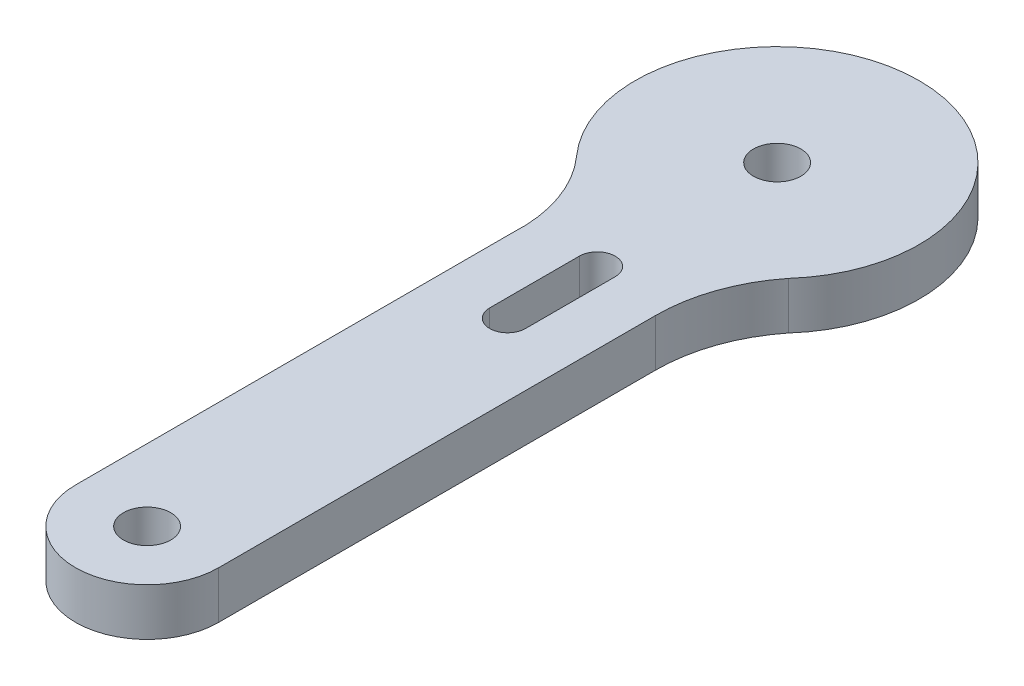
ISO-10303-21;
HEADER;
FILE_DESCRIPTION(('STEP AP214'),'2;1');
FILE_NAME('part.step','',(''),(''),'','','');
FILE_SCHEMA(('AUTOMOTIVE_DESIGN { 1 0 10303 214 1 1 1 1 }'));
ENDSEC;
DATA;
#1=APPLICATION_CONTEXT('core data for automotive mechanical design processes');
#2=APPLICATION_PROTOCOL_DEFINITION('international standard','automotive_design',2000,#1);
#3=PRODUCT_CONTEXT('',#1,'mechanical');
#4=PRODUCT('Part','Part','',(#3));
#5=PRODUCT_RELATED_PRODUCT_CATEGORY('part','',(#4));
#6=PRODUCT_DEFINITION_FORMATION('','',#4);
#7=PRODUCT_DEFINITION_CONTEXT('part definition',#1,'design');
#8=PRODUCT_DEFINITION('design','',#6,#7);
#9=PRODUCT_DEFINITION_SHAPE('','',#8);
#10=(LENGTH_UNIT() NAMED_UNIT(*) SI_UNIT(.MILLI.,.METRE.));
#11=(NAMED_UNIT(*) PLANE_ANGLE_UNIT() SI_UNIT($,.RADIAN.));
#12=(NAMED_UNIT(*) SI_UNIT($,.STERADIAN.) SOLID_ANGLE_UNIT());
#13=UNCERTAINTY_MEASURE_WITH_UNIT(LENGTH_MEASURE(1.E-05),#10,'distance_accuracy_value','');
#14=(GEOMETRIC_REPRESENTATION_CONTEXT(3) GLOBAL_UNCERTAINTY_ASSIGNED_CONTEXT((#13)) GLOBAL_UNIT_ASSIGNED_CONTEXT((#10,
#11,#12)) REPRESENTATION_CONTEXT('',''));
#15=CARTESIAN_POINT('',(0.,0.,0.));
#16=DIRECTION('',(0.,0.,1.));
#17=DIRECTION('',(1.,0.,0.));
#18=AXIS2_PLACEMENT_3D('',#15,#16,#17);
#19=CARTESIAN_POINT('',(14.3483212893798,3.048,-7.38545450211768));
#20=DIRECTION('',(0.,-1.,0.));
#21=DIRECTION('',(0.,0.,-1.));
#22=AXIS2_PLACEMENT_3D('',#19,#20,#21);
#23=PLANE('',#22);
#24=CARTESIAN_POINT('',(-0.49046409629303,3.048,-19.8255035501036));
#25=DIRECTION('',(0.,1.,0.));
#26=DIRECTION('',(0.,0.,1.));
#27=AXIS2_PLACEMENT_3D('',#24,#25,#26);
#28=CIRCLE('',#27,1.524);
#29=CARTESIAN_POINT('',(-0.49046409629303,3.048,-21.3495035501036));
#30=VERTEX_POINT('',#29);
#31=EDGE_CURVE('E148',#30,#30,#28,.T.);
#32=ORIENTED_EDGE('',*,*,#31,.F.);
#33=EDGE_LOOP('',(#32));
#34=FACE_BOUND('',#33,.T.);
#35=CARTESIAN_POINT('',(14.3483212893798,3.048,-7.38545450211768));
#36=DIRECTION('',(0.,-1.,0.));
#37=DIRECTION('',(0.,0.,-1.));
#38=AXIS2_PLACEMENT_3D('',#35,#36,#37);
#39=CIRCLE('',#38,10.2282816118927);
#40=CARTESIAN_POINT('',(4.12003967748704,3.048,-7.38545450211768));
#41=VERTEX_POINT('',#40);
#42=CARTESIAN_POINT('',(6.32601765129162,3.048,-13.7305619929724));
#43=VERTEX_POINT('',#42);
#44=EDGE_CURVE('E154',#41,#43,#39,.T.);
#45=ORIENTED_EDGE('',*,*,#44,.T.);
#46=CARTESIAN_POINT('',(-0.49046409629303,3.048,-19.8255035501036));
#47=DIRECTION('',(0.,1.,0.));
#48=DIRECTION('',(0.,0.,1.));
#49=AXIS2_PLACEMENT_3D('',#46,#47,#48);
#50=CIRCLE('',#49,9.144);
#51=CARTESIAN_POINT('',(-7.30694584387768,3.048,-13.7305619929724));
#52=VERTEX_POINT('',#51);
#53=EDGE_CURVE('E157',#43,#52,#50,.T.);
#54=ORIENTED_EDGE('',*,*,#53,.T.);
#55=CARTESIAN_POINT('',(-13.8140717595721,3.048,-7.9122302450579));
#56=DIRECTION('',(0.,-1.,0.));
#57=DIRECTION('',(0.,0.,-1.));
#58=AXIS2_PLACEMENT_3D('',#55,#56,#57);
#59=CIRCLE('',#58,8.72901323240442);
#60=CARTESIAN_POINT('',(-5.10096787357709,3.048,-7.38545450211768));
#61=VERTEX_POINT('',#60);
#62=EDGE_CURVE('E160',#52,#61,#59,.T.);
#63=ORIENTED_EDGE('',*,*,#62,.T.);
#64=DIRECTION('',(0.,0.,1.));
#65=VECTOR('',#64,1.);
#66=CARTESIAN_POINT('',(-5.10096787357708,3.048,20.7354787461048));
#67=LINE('',#66,#65);
#68=CARTESIAN_POINT('',(-5.10096787357708,3.048,20.7354787461048));
#69=VERTEX_POINT('',#68);
#70=EDGE_CURVE('E162',#61,#69,#67,.T.);
#71=ORIENTED_EDGE('',*,*,#70,.T.);
#72=CARTESIAN_POINT('',(-0.490464098045022,3.048,20.7354787461048));
#73=DIRECTION('',(0.,1.,0.));
#74=DIRECTION('',(0.,0.,1.));
#75=AXIS2_PLACEMENT_3D('',#72,#73,#74);
#76=CIRCLE('',#75,4.61050377553206);
#77=CARTESIAN_POINT('',(4.12003967748704,3.048,20.7354787461048));
#78=VERTEX_POINT('',#77);
#79=EDGE_CURVE('E164',#69,#78,#76,.T.);
#80=ORIENTED_EDGE('',*,*,#79,.T.);
#81=DIRECTION('',(0.,0.,-1.));
#82=VECTOR('',#81,1.);
#83=CARTESIAN_POINT('',(4.12003967748704,3.048,-7.38545450211768));
#84=LINE('',#83,#82);
#85=EDGE_CURVE('E166',#78,#41,#84,.T.);
#86=ORIENTED_EDGE('',*,*,#85,.T.);
#87=EDGE_LOOP('',(#45,#54,#63,#71,#80,#86));
#88=FACE_BOUND('',#87,.T.);
#89=CARTESIAN_POINT('',(-0.490500680274846,3.048,-8.2468715254583));
#90=DIRECTION('',(0.,1.,0.));
#91=DIRECTION('',(0.,0.,-1.));
#92=AXIS2_PLACEMENT_3D('',#89,#90,#91);
#93=CIRCLE('',#92,1.1526259438827);
#94=CARTESIAN_POINT('',(0.662125263607858,3.048,-8.2468715254583));
#95=VERTEX_POINT('',#94);
#96=CARTESIAN_POINT('',(-1.64312662415755,3.048,-8.2468715254583));
#97=VERTEX_POINT('',#96);
#98=EDGE_CURVE('E109',#95,#97,#93,.T.);
#99=ORIENTED_EDGE('',*,*,#98,.F.);
#100=DIRECTION('',(0.,0.,-1.));
#101=VECTOR('',#100,1.);
#102=CARTESIAN_POINT('',(0.662125263607858,3.048,-2.4732754603921));
#103=LINE('',#102,#101);
#104=CARTESIAN_POINT('',(0.662125263607858,3.048,-2.4732754603921));
#105=VERTEX_POINT('',#104);
#106=EDGE_CURVE('E132',#105,#95,#103,.T.);
#107=ORIENTED_EDGE('',*,*,#106,.F.);
#108=CARTESIAN_POINT('',(-0.490500680274846,3.048,-2.4732754603921));
#109=DIRECTION('',(0.,1.,0.));
#110=DIRECTION('',(0.,0.,1.));
#111=AXIS2_PLACEMENT_3D('',#108,#109,#110);
#112=CIRCLE('',#111,1.1526259438827);
#113=CARTESIAN_POINT('',(-1.64312662415755,3.048,-2.4732754603921));
#114=VERTEX_POINT('',#113);
#115=EDGE_CURVE('E130',#114,#105,#112,.T.);
#116=ORIENTED_EDGE('',*,*,#115,.F.);
#117=DIRECTION('',(0.,0.,1.));
#118=VECTOR('',#117,1.);
#119=CARTESIAN_POINT('',(-1.64312662415755,3.048,-8.2468715254583));
#120=LINE('',#119,#118);
#121=EDGE_CURVE('E117',#97,#114,#120,.T.);
#122=ORIENTED_EDGE('',*,*,#121,.F.);
#123=EDGE_LOOP('',(#99,#107,#116,#122));
#124=FACE_BOUND('',#123,.T.);
#125=CARTESIAN_POINT('',(-0.490464098045022,3.048,20.7354787461048));
#126=DIRECTION('',(0.,1.,0.));
#127=DIRECTION('',(0.,0.,1.));
#128=AXIS2_PLACEMENT_3D('',#125,#126,#127);
#129=CIRCLE('',#128,1.524);
#130=CARTESIAN_POINT('',(-0.490464098045022,3.048,19.2114787461048));
#131=VERTEX_POINT('',#130);
#132=EDGE_CURVE('E138',#131,#131,#129,.T.);
#133=ORIENTED_EDGE('',*,*,#132,.F.);
#134=EDGE_LOOP('',(#133));
#135=FACE_BOUND('',#134,.T.);
#136=ADVANCED_FACE('F32',(#34,#88,#124,#135),#23,.F.);
#137=CARTESIAN_POINT('',(14.3483212893798,0.,-7.38545450211768));
#138=DIRECTION('',(0.,-1.,0.));
#139=DIRECTION('',(0.,0.,-1.));
#140=AXIS2_PLACEMENT_3D('',#137,#138,#139);
#141=PLANE('',#140);
#142=DIRECTION('',(0.,0.,-1.));
#143=VECTOR('',#142,1.);
#144=CARTESIAN_POINT('',(0.662125263607858,0.,-2.4732754603921));
#145=LINE('',#144,#143);
#146=CARTESIAN_POINT('',(0.662125263607858,0.,-2.4732754603921));
#147=VERTEX_POINT('',#146);
#148=CARTESIAN_POINT('',(0.662125263607857,0.,-8.2468715254583));
#149=VERTEX_POINT('',#148);
#150=EDGE_CURVE('E118',#147,#149,#145,.T.);
#151=ORIENTED_EDGE('',*,*,#150,.T.);
#152=CARTESIAN_POINT('',(-0.490500680274846,0.,-8.2468715254583));
#153=DIRECTION('',(0.,1.,0.));
#154=DIRECTION('',(0.,0.,-1.));
#155=AXIS2_PLACEMENT_3D('',#152,#153,#154);
#156=CIRCLE('',#155,1.1526259438827);
#157=CARTESIAN_POINT('',(-1.64312662415755,0.,-8.2468715254583));
#158=VERTEX_POINT('',#157);
#159=EDGE_CURVE('E55',#149,#158,#156,.T.);
#160=ORIENTED_EDGE('',*,*,#159,.T.);
#161=DIRECTION('',(0.,0.,1.));
#162=VECTOR('',#161,1.);
#163=CARTESIAN_POINT('',(-1.64312662415755,0.,-8.2468715254583));
#164=LINE('',#163,#162);
#165=CARTESIAN_POINT('',(-1.64312662415755,0.,-2.4732754603921));
#166=VERTEX_POINT('',#165);
#167=EDGE_CURVE('E124',#158,#166,#164,.T.);
#168=ORIENTED_EDGE('',*,*,#167,.T.);
#169=CARTESIAN_POINT('',(-0.490500680274846,0.,-2.4732754603921));
#170=DIRECTION('',(0.,1.,0.));
#171=DIRECTION('',(0.,0.,1.));
#172=AXIS2_PLACEMENT_3D('',#169,#170,#171);
#173=CIRCLE('',#172,1.1526259438827);
#174=EDGE_CURVE('E140',#166,#147,#173,.T.);
#175=ORIENTED_EDGE('',*,*,#174,.T.);
#176=EDGE_LOOP('',(#151,#160,#168,#175));
#177=FACE_BOUND('',#176,.T.);
#178=CARTESIAN_POINT('',(-0.49046409629303,0.,-19.8255035501036));
#179=DIRECTION('',(0.,1.,0.));
#180=DIRECTION('',(0.,0.,1.));
#181=AXIS2_PLACEMENT_3D('',#178,#179,#180);
#182=CIRCLE('',#181,1.524);
#183=CARTESIAN_POINT('',(-0.49046409629303,0.,-21.3495035501036));
#184=VERTEX_POINT('',#183);
#185=EDGE_CURVE('E125',#184,#184,#182,.T.);
#186=ORIENTED_EDGE('',*,*,#185,.T.);
#187=EDGE_LOOP('',(#186));
#188=FACE_BOUND('',#187,.T.);
#189=CARTESIAN_POINT('',(14.3483212893798,0.,-7.38545450211768));
#190=DIRECTION('',(0.,-1.,0.));
#191=DIRECTION('',(0.,0.,-1.));
#192=AXIS2_PLACEMENT_3D('',#189,#190,#191);
#193=CIRCLE('',#192,10.2282816118927);
#194=CARTESIAN_POINT('',(4.12003967748704,0.,-7.38545450211768));
#195=VERTEX_POINT('',#194);
#196=CARTESIAN_POINT('',(6.32601765129162,0.,-13.7305619929724));
#197=VERTEX_POINT('',#196);
#198=EDGE_CURVE('E151',#195,#197,#193,.T.);
#199=ORIENTED_EDGE('',*,*,#198,.F.);
#200=DIRECTION('',(0.,0.,-1.));
#201=VECTOR('',#200,1.);
#202=CARTESIAN_POINT('',(4.12003967748704,0.,-7.38545450211768));
#203=LINE('',#202,#201);
#204=CARTESIAN_POINT('',(4.12003967748704,0.,20.7354787461048));
#205=VERTEX_POINT('',#204);
#206=EDGE_CURVE('E158',#205,#195,#203,.T.);
#207=ORIENTED_EDGE('',*,*,#206,.F.);
#208=CARTESIAN_POINT('',(-0.490464098045022,0.,20.7354787461048));
#209=DIRECTION('',(0.,1.,0.));
#210=DIRECTION('',(0.,0.,1.));
#211=AXIS2_PLACEMENT_3D('',#208,#209,#210);
#212=CIRCLE('',#211,4.61050377553206);
#213=CARTESIAN_POINT('',(-5.10096787357708,0.,20.7354787461048));
#214=VERTEX_POINT('',#213);
#215=EDGE_CURVE('E177',#214,#205,#212,.T.);
#216=ORIENTED_EDGE('',*,*,#215,.F.);
#217=DIRECTION('',(0.,0.,1.));
#218=VECTOR('',#217,1.);
#219=CARTESIAN_POINT('',(-5.10096787357708,0.,20.7354787461048));
#220=LINE('',#219,#218);
#221=CARTESIAN_POINT('',(-5.10096787357709,0.,-7.38545450211768));
#222=VERTEX_POINT('',#221);
#223=EDGE_CURVE('E175',#222,#214,#220,.T.);
#224=ORIENTED_EDGE('',*,*,#223,.F.);
#225=CARTESIAN_POINT('',(-13.8140717595721,0.,-7.9122302450579));
#226=DIRECTION('',(0.,-1.,0.));
#227=DIRECTION('',(0.,0.,-1.));
#228=AXIS2_PLACEMENT_3D('',#225,#226,#227);
#229=CIRCLE('',#228,8.72901323240442);
#230=CARTESIAN_POINT('',(-7.30694584387768,0.,-13.7305619929724));
#231=VERTEX_POINT('',#230);
#232=EDGE_CURVE('E173',#231,#222,#229,.T.);
#233=ORIENTED_EDGE('',*,*,#232,.F.);
#234=CARTESIAN_POINT('',(-0.49046409629303,0.,-19.8255035501036));
#235=DIRECTION('',(0.,1.,0.));
#236=DIRECTION('',(0.,0.,1.));
#237=AXIS2_PLACEMENT_3D('',#234,#235,#236);
#238=CIRCLE('',#237,9.144);
#239=EDGE_CURVE('E171',#197,#231,#238,.T.);
#240=ORIENTED_EDGE('',*,*,#239,.F.);
#241=EDGE_LOOP('',(#199,#207,#216,#224,#233,#240));
#242=FACE_BOUND('',#241,.T.);
#243=CARTESIAN_POINT('',(-0.490464098045022,0.,20.7354787461048));
#244=DIRECTION('',(0.,1.,0.));
#245=DIRECTION('',(0.,0.,1.));
#246=AXIS2_PLACEMENT_3D('',#243,#244,#245);
#247=CIRCLE('',#246,1.524);
#248=CARTESIAN_POINT('',(-0.490464098045022,0.,19.2114787461048));
#249=VERTEX_POINT('',#248);
#250=EDGE_CURVE('E263',#249,#249,#247,.T.);
#251=ORIENTED_EDGE('',*,*,#250,.T.);
#252=EDGE_LOOP('',(#251));
#253=FACE_BOUND('',#252,.T.);
#254=ADVANCED_FACE('F201',(#177,#188,#242,#253),#141,.T.);
#255=CARTESIAN_POINT('',(14.3483212893798,3.048,-7.38545450211768));
#256=DIRECTION('',(0.,-1.,0.));
#257=DIRECTION('',(0.,0.,-1.));
#258=AXIS2_PLACEMENT_3D('',#255,#256,#257);
#259=CYLINDRICAL_SURFACE('',#258,10.2282816118927);
#260=ORIENTED_EDGE('',*,*,#198,.T.);
#261=DIRECTION('',(0.,-1.,0.));
#262=VECTOR('',#261,1.);
#263=CARTESIAN_POINT('',(6.32601765129162,3.048,-13.7305619929724));
#264=LINE('',#263,#262);
#265=EDGE_CURVE('E11',#43,#197,#264,.T.);
#266=ORIENTED_EDGE('',*,*,#265,.F.);
#267=ORIENTED_EDGE('',*,*,#44,.F.);
#268=DIRECTION('',(0.,-1.,0.));
#269=VECTOR('',#268,1.);
#270=CARTESIAN_POINT('',(4.12003967748704,3.048,-7.38545450211768));
#271=LINE('',#270,#269);
#272=EDGE_CURVE('E168',#41,#195,#271,.T.);
#273=ORIENTED_EDGE('',*,*,#272,.T.);
#274=EDGE_LOOP('',(#260,#266,#267,#273));
#275=FACE_BOUND('',#274,.T.);
#276=ADVANCED_FACE('F34',(#275),#259,.F.);
#277=CARTESIAN_POINT('',(-0.49046409629303,3.048,-19.8255035501036));
#278=DIRECTION('',(0.,-1.,0.));
#279=DIRECTION('',(0.,0.,-1.));
#280=AXIS2_PLACEMENT_3D('',#277,#278,#279);
#281=CYLINDRICAL_SURFACE('',#280,9.144);
#282=ORIENTED_EDGE('',*,*,#239,.T.);
#283=DIRECTION('',(0.,-1.,0.));
#284=VECTOR('',#283,1.);
#285=CARTESIAN_POINT('',(-7.30694584387768,3.048,-13.7305619929724));
#286=LINE('',#285,#284);
#287=EDGE_CURVE('E40',#52,#231,#286,.T.);
#288=ORIENTED_EDGE('',*,*,#287,.F.);
#289=ORIENTED_EDGE('',*,*,#53,.F.);
#290=ORIENTED_EDGE('',*,*,#265,.T.);
#291=EDGE_LOOP('',(#282,#288,#289,#290));
#292=FACE_BOUND('',#291,.T.);
#293=ADVANCED_FACE('F218',(#292),#281,.T.);
#294=CARTESIAN_POINT('',(-13.8140717595721,3.048,-7.9122302450579));
#295=DIRECTION('',(0.,-1.,0.));
#296=DIRECTION('',(0.,0.,-1.));
#297=AXIS2_PLACEMENT_3D('',#294,#295,#296);
#298=CYLINDRICAL_SURFACE('',#297,8.72901323240442);
#299=ORIENTED_EDGE('',*,*,#232,.T.);
#300=DIRECTION('',(0.,-1.,0.));
#301=VECTOR('',#300,1.);
#302=CARTESIAN_POINT('',(-5.10096787357709,3.048,-7.38545450211768));
#303=LINE('',#302,#301);
#304=EDGE_CURVE('E188',#61,#222,#303,.T.);
#305=ORIENTED_EDGE('',*,*,#304,.F.);
#306=ORIENTED_EDGE('',*,*,#62,.F.);
#307=ORIENTED_EDGE('',*,*,#287,.T.);
#308=EDGE_LOOP('',(#299,#305,#306,#307));
#309=FACE_BOUND('',#308,.T.);
#310=ADVANCED_FACE('F195',(#309),#298,.F.);
#311=CARTESIAN_POINT('',(-5.10096787357708,3.048,20.7354787461048));
#312=DIRECTION('',(1.,0.,0.));
#313=DIRECTION('',(0.,0.,-1.));
#314=AXIS2_PLACEMENT_3D('',#311,#312,#313);
#315=PLANE('',#314);
#316=ORIENTED_EDGE('',*,*,#223,.T.);
#317=DIRECTION('',(0.,-1.,0.));
#318=VECTOR('',#317,1.);
#319=CARTESIAN_POINT('',(-5.10096787357708,3.048,20.7354787461048));
#320=LINE('',#319,#318);
#321=EDGE_CURVE('E185',#69,#214,#320,.T.);
#322=ORIENTED_EDGE('',*,*,#321,.F.);
#323=ORIENTED_EDGE('',*,*,#70,.F.);
#324=ORIENTED_EDGE('',*,*,#304,.T.);
#325=EDGE_LOOP('',(#316,#322,#323,#324));
#326=FACE_BOUND('',#325,.T.);
#327=ADVANCED_FACE('F207',(#326),#315,.F.);
#328=CARTESIAN_POINT('',(-0.490464098045022,3.048,20.7354787461048));
#329=DIRECTION('',(0.,-1.,0.));
#330=DIRECTION('',(0.,0.,-1.));
#331=AXIS2_PLACEMENT_3D('',#328,#329,#330);
#332=CYLINDRICAL_SURFACE('',#331,4.61050377553206);
#333=ORIENTED_EDGE('',*,*,#215,.T.);
#334=DIRECTION('',(0.,-1.,0.));
#335=VECTOR('',#334,1.);
#336=CARTESIAN_POINT('',(4.12003967748704,3.048,20.7354787461048));
#337=LINE('',#336,#335);
#338=EDGE_CURVE('E182',#78,#205,#337,.T.);
#339=ORIENTED_EDGE('',*,*,#338,.F.);
#340=ORIENTED_EDGE('',*,*,#79,.F.);
#341=ORIENTED_EDGE('',*,*,#321,.T.);
#342=EDGE_LOOP('',(#333,#339,#340,#341));
#343=FACE_BOUND('',#342,.T.);
#344=ADVANCED_FACE('F211',(#343),#332,.T.);
#345=CARTESIAN_POINT('',(4.12003967748704,3.048,-7.38545450211768));
#346=DIRECTION('',(-1.,0.,0.));
#347=DIRECTION('',(0.,0.,1.));
#348=AXIS2_PLACEMENT_3D('',#345,#346,#347);
#349=PLANE('',#348);
#350=ORIENTED_EDGE('',*,*,#206,.T.);
#351=ORIENTED_EDGE('',*,*,#272,.F.);
#352=ORIENTED_EDGE('',*,*,#85,.F.);
#353=ORIENTED_EDGE('',*,*,#338,.T.);
#354=EDGE_LOOP('',(#350,#351,#352,#353));
#355=FACE_BOUND('',#354,.T.);
#356=ADVANCED_FACE('F221',(#355),#349,.F.);
#357=CARTESIAN_POINT('',(-0.49046409629303,3.048,-19.8255035501036));
#358=DIRECTION('',(0.,-1.,0.));
#359=DIRECTION('',(0.,0.,-1.));
#360=AXIS2_PLACEMENT_3D('',#357,#358,#359);
#361=CYLINDRICAL_SURFACE('',#360,1.524);
#362=CARTESIAN_POINT('',(-0.49046409629303,3.048,-21.3495035501036));
#363=CARTESIAN_POINT('',(-0.49046409629303,3.01625,-21.3495035501036));
#364=CARTESIAN_POINT('',(-0.49046409629303,2.9845,-21.3495035501036));
#365=CARTESIAN_POINT('',(-0.49046409629303,2.921,-21.3495035501036));
#366=CARTESIAN_POINT('',(-0.49046409629303,2.88925,-21.3495035501036));
#367=CARTESIAN_POINT('',(-0.49046409629303,2.82575,-21.3495035501036));
#368=CARTESIAN_POINT('',(-0.49046409629303,2.794,-21.3495035501036));
#369=CARTESIAN_POINT('',(-0.49046409629303,2.7305,-21.3495035501036));
#370=CARTESIAN_POINT('',(-0.49046409629303,2.69875,-21.3495035501036));
#371=CARTESIAN_POINT('',(-0.49046409629303,2.63525,-21.3495035501036));
#372=CARTESIAN_POINT('',(-0.49046409629303,2.6035,-21.3495035501036));
#373=CARTESIAN_POINT('',(-0.49046409629303,2.54,-21.3495035501036));
#374=CARTESIAN_POINT('',(-0.49046409629303,2.50825,-21.3495035501036));
#375=CARTESIAN_POINT('',(-0.49046409629303,2.44475,-21.3495035501036));
#376=CARTESIAN_POINT('',(-0.49046409629303,2.413,-21.3495035501036));
#377=CARTESIAN_POINT('',(-0.49046409629303,2.3495,-21.3495035501036));
#378=CARTESIAN_POINT('',(-0.49046409629303,2.31775,-21.3495035501036));
#379=CARTESIAN_POINT('',(-0.49046409629303,2.25425,-21.3495035501036));
#380=CARTESIAN_POINT('',(-0.49046409629303,2.2225,-21.3495035501036));
#381=CARTESIAN_POINT('',(-0.49046409629303,2.159,-21.3495035501036));
#382=CARTESIAN_POINT('',(-0.49046409629303,2.12725,-21.3495035501036));
#383=CARTESIAN_POINT('',(-0.49046409629303,2.06375,-21.3495035501036));
#384=CARTESIAN_POINT('',(-0.49046409629303,2.032,-21.3495035501036));
#385=CARTESIAN_POINT('',(-0.49046409629303,1.9685,-21.3495035501036));
#386=CARTESIAN_POINT('',(-0.49046409629303,1.93675,-21.3495035501036));
#387=CARTESIAN_POINT('',(-0.49046409629303,1.87325,-21.3495035501036));
#388=CARTESIAN_POINT('',(-0.49046409629303,1.8415,-21.3495035501036));
#389=CARTESIAN_POINT('',(-0.49046409629303,1.778,-21.3495035501036));
#390=CARTESIAN_POINT('',(-0.49046409629303,1.74625,-21.3495035501036));
#391=CARTESIAN_POINT('',(-0.49046409629303,1.68275,-21.3495035501036));
#392=CARTESIAN_POINT('',(-0.49046409629303,1.651,-21.3495035501036));
#393=CARTESIAN_POINT('',(-0.49046409629303,1.5875,-21.3495035501036));
#394=CARTESIAN_POINT('',(-0.49046409629303,1.55575,-21.3495035501036));
#395=CARTESIAN_POINT('',(-0.49046409629303,1.49225,-21.3495035501036));
#396=CARTESIAN_POINT('',(-0.49046409629303,1.4605,-21.3495035501036));
#397=CARTESIAN_POINT('',(-0.49046409629303,1.397,-21.3495035501036));
#398=CARTESIAN_POINT('',(-0.49046409629303,1.36525,-21.3495035501036));
#399=CARTESIAN_POINT('',(-0.49046409629303,1.30175,-21.3495035501036));
#400=CARTESIAN_POINT('',(-0.49046409629303,1.27,-21.3495035501036));
#401=CARTESIAN_POINT('',(-0.49046409629303,1.2065,-21.3495035501036));
#402=CARTESIAN_POINT('',(-0.49046409629303,1.17475,-21.3495035501036));
#403=CARTESIAN_POINT('',(-0.49046409629303,1.11125,-21.3495035501036));
#404=CARTESIAN_POINT('',(-0.49046409629303,1.0795,-21.3495035501036));
#405=CARTESIAN_POINT('',(-0.49046409629303,1.016,-21.3495035501036));
#406=CARTESIAN_POINT('',(-0.49046409629303,0.98425,-21.3495035501036));
#407=CARTESIAN_POINT('',(-0.49046409629303,0.92075,-21.3495035501036));
#408=CARTESIAN_POINT('',(-0.49046409629303,0.889,-21.3495035501036));
#409=CARTESIAN_POINT('',(-0.49046409629303,0.8255,-21.3495035501036));
#410=CARTESIAN_POINT('',(-0.49046409629303,0.79375,-21.3495035501036));
#411=CARTESIAN_POINT('',(-0.49046409629303,0.73025,-21.3495035501036));
#412=CARTESIAN_POINT('',(-0.49046409629303,0.6985,-21.3495035501036));
#413=CARTESIAN_POINT('',(-0.49046409629303,0.635,-21.3495035501036));
#414=CARTESIAN_POINT('',(-0.49046409629303,0.60325,-21.3495035501036));
#415=CARTESIAN_POINT('',(-0.49046409629303,0.53975,-21.3495035501036));
#416=CARTESIAN_POINT('',(-0.49046409629303,0.508,-21.3495035501036));
#417=CARTESIAN_POINT('',(-0.49046409629303,0.4445,-21.3495035501036));
#418=CARTESIAN_POINT('',(-0.49046409629303,0.41275,-21.3495035501036));
#419=CARTESIAN_POINT('',(-0.49046409629303,0.34925,-21.3495035501036));
#420=CARTESIAN_POINT('',(-0.49046409629303,0.3175,-21.3495035501036));
#421=CARTESIAN_POINT('',(-0.49046409629303,0.254,-21.3495035501036));
#422=CARTESIAN_POINT('',(-0.49046409629303,0.22225,-21.3495035501036));
#423=CARTESIAN_POINT('',(-0.49046409629303,0.15875,-21.3495035501036));
#424=CARTESIAN_POINT('',(-0.49046409629303,0.127,-21.3495035501036));
#425=CARTESIAN_POINT('',(-0.49046409629303,0.0634999999999999,-21.3495035501036));
#426=CARTESIAN_POINT('',(-0.49046409629303,0.03175,-21.3495035501036));
#427=CARTESIAN_POINT('',(-0.49046409629303,0.,-21.3495035501036));
#428=B_SPLINE_CURVE_WITH_KNOTS('',3,(#362,#363,#364,#365,#366,#367,#368,#369,#370,#371,#372,
#373,#374,#375,#376,#377,#378,#379,#380,#381,#382,#383,#384,#385,#386,#387,#388,#389,#390,#391,
#392,#393,#394,#395,#396,#397,#398,#399,#400,#401,#402,#403,#404,#405,#406,#407,#408,#409,#410,
#411,#412,#413,#414,#415,#416,#417,#418,#419,#420,#421,#422,#423,#424,#425,#426,#427),
.UNSPECIFIED.,.F.,.F.,(4,2,2,2,2,2,2,2,2,2,2,2,2,2,2,2,2,2,2,2,2,2,2,2,2,2,2,2,2,2,2,2,4),(0.,
0.0952499999999998,0.1905,0.28575,0.381,0.47625,0.5715,0.66675,0.762,0.85725,0.9525,1.04775,
1.143,1.23825,1.3335,1.42875,1.524,1.61925,1.7145,1.80975,1.905,2.00025,2.0955,2.19075,2.286,
2.38125,2.4765,2.57175,2.667,2.76225,2.8575,2.95275,3.048),.UNSPECIFIED.);
#429=EDGE_CURVE('BSEAM223',#30,#184,#428,.T.);
#430=ORIENTED_EDGE('',*,*,#31,.T.);
#431=ORIENTED_EDGE('',*,*,#185,.F.);
#432=ORIENTED_EDGE('',*,*,#429,.T.);
#433=ORIENTED_EDGE('',*,*,#429,.F.);
#434=EDGE_LOOP('',(#430,#432,#431,#433));
#435=FACE_BOUND('',#434,.T.);
#436=ADVANCED_FACE('F223',(#435),#361,.F.);
#437=CARTESIAN_POINT('',(-0.490500680274846,3.048,-8.2468715254583));
#438=DIRECTION('',(0.,-1.,0.));
#439=DIRECTION('',(0.,0.,-1.));
#440=AXIS2_PLACEMENT_3D('',#437,#438,#439);
#441=CYLINDRICAL_SURFACE('',#440,1.1526259438827);
#442=ORIENTED_EDGE('',*,*,#159,.F.);
#443=DIRECTION('',(0.,-1.,0.));
#444=VECTOR('',#443,1.);
#445=CARTESIAN_POINT('',(0.662125263607858,3.048,-8.2468715254583));
#446=LINE('',#445,#444);
#447=EDGE_CURVE('E113',#95,#149,#446,.T.);
#448=ORIENTED_EDGE('',*,*,#447,.F.);
#449=ORIENTED_EDGE('',*,*,#98,.T.);
#450=DIRECTION('',(0.,-1.,0.));
#451=VECTOR('',#450,1.);
#452=CARTESIAN_POINT('',(-1.64312662415755,3.048,-8.2468715254583));
#453=LINE('',#452,#451);
#454=EDGE_CURVE('E112',#97,#158,#453,.T.);
#455=ORIENTED_EDGE('',*,*,#454,.T.);
#456=EDGE_LOOP('',(#442,#448,#449,#455));
#457=FACE_BOUND('',#456,.T.);
#458=ADVANCED_FACE('F111',(#457),#441,.F.);
#459=CARTESIAN_POINT('',(-1.64312662415755,3.048,-8.2468715254583));
#460=DIRECTION('',(1.,0.,0.));
#461=DIRECTION('',(0.,0.,-1.));
#462=AXIS2_PLACEMENT_3D('',#459,#460,#461);
#463=PLANE('',#462);
#464=ORIENTED_EDGE('',*,*,#167,.F.);
#465=ORIENTED_EDGE('',*,*,#454,.F.);
#466=ORIENTED_EDGE('',*,*,#121,.T.);
#467=DIRECTION('',(0.,-1.,0.));
#468=VECTOR('',#467,1.);
#469=CARTESIAN_POINT('',(-1.64312662415755,3.048,-2.4732754603921));
#470=LINE('',#469,#468);
#471=EDGE_CURVE('E126',#114,#166,#470,.T.);
#472=ORIENTED_EDGE('',*,*,#471,.T.);
#473=EDGE_LOOP('',(#464,#465,#466,#472));
#474=FACE_BOUND('',#473,.T.);
#475=ADVANCED_FACE('F121',(#474),#463,.T.);
#476=CARTESIAN_POINT('',(-0.490500680274846,3.048,-2.4732754603921));
#477=DIRECTION('',(0.,-1.,0.));
#478=DIRECTION('',(0.,0.,-1.));
#479=AXIS2_PLACEMENT_3D('',#476,#477,#478);
#480=CYLINDRICAL_SURFACE('',#479,1.1526259438827);
#481=ORIENTED_EDGE('',*,*,#174,.F.);
#482=ORIENTED_EDGE('',*,*,#471,.F.);
#483=ORIENTED_EDGE('',*,*,#115,.T.);
#484=DIRECTION('',(0.,-1.,0.));
#485=VECTOR('',#484,1.);
#486=CARTESIAN_POINT('',(0.662125263607858,3.048,-2.4732754603921));
#487=LINE('',#486,#485);
#488=EDGE_CURVE('E47',#105,#147,#487,.T.);
#489=ORIENTED_EDGE('',*,*,#488,.T.);
#490=EDGE_LOOP('',(#481,#482,#483,#489));
#491=FACE_BOUND('',#490,.T.);
#492=ADVANCED_FACE('F246',(#491),#480,.F.);
#493=CARTESIAN_POINT('',(0.662125263607858,3.048,-2.4732754603921));
#494=DIRECTION('',(-1.,0.,0.));
#495=DIRECTION('',(0.,0.,1.));
#496=AXIS2_PLACEMENT_3D('',#493,#494,#495);
#497=PLANE('',#496);
#498=ORIENTED_EDGE('',*,*,#150,.F.);
#499=ORIENTED_EDGE('',*,*,#488,.F.);
#500=ORIENTED_EDGE('',*,*,#106,.T.);
#501=ORIENTED_EDGE('',*,*,#447,.T.);
#502=EDGE_LOOP('',(#498,#499,#500,#501));
#503=FACE_BOUND('',#502,.T.);
#504=ADVANCED_FACE('F249',(#503),#497,.T.);
#505=CARTESIAN_POINT('',(-0.490464098045022,3.048,20.7354787461048));
#506=DIRECTION('',(0.,-1.,0.));
#507=DIRECTION('',(0.,0.,-1.));
#508=AXIS2_PLACEMENT_3D('',#505,#506,#507);
#509=CYLINDRICAL_SURFACE('',#508,1.524);
#510=CARTESIAN_POINT('',(-0.490464098045022,3.048,19.2114787461048));
#511=CARTESIAN_POINT('',(-0.490464098045022,3.01625,19.2114787461048));
#512=CARTESIAN_POINT('',(-0.490464098045022,2.9845,19.2114787461048));
#513=CARTESIAN_POINT('',(-0.490464098045022,2.921,19.2114787461048));
#514=CARTESIAN_POINT('',(-0.490464098045022,2.88925,19.2114787461048));
#515=CARTESIAN_POINT('',(-0.490464098045022,2.82575,19.2114787461048));
#516=CARTESIAN_POINT('',(-0.490464098045022,2.794,19.2114787461048));
#517=CARTESIAN_POINT('',(-0.490464098045022,2.7305,19.2114787461048));
#518=CARTESIAN_POINT('',(-0.490464098045022,2.69875,19.2114787461048));
#519=CARTESIAN_POINT('',(-0.490464098045022,2.63525,19.2114787461048));
#520=CARTESIAN_POINT('',(-0.490464098045022,2.6035,19.2114787461048));
#521=CARTESIAN_POINT('',(-0.490464098045022,2.54,19.2114787461048));
#522=CARTESIAN_POINT('',(-0.490464098045022,2.50825,19.2114787461048));
#523=CARTESIAN_POINT('',(-0.490464098045022,2.44475,19.2114787461048));
#524=CARTESIAN_POINT('',(-0.490464098045022,2.413,19.2114787461048));
#525=CARTESIAN_POINT('',(-0.490464098045022,2.3495,19.2114787461048));
#526=CARTESIAN_POINT('',(-0.490464098045022,2.31775,19.2114787461048));
#527=CARTESIAN_POINT('',(-0.490464098045022,2.25425,19.2114787461048));
#528=CARTESIAN_POINT('',(-0.490464098045022,2.2225,19.2114787461048));
#529=CARTESIAN_POINT('',(-0.490464098045022,2.159,19.2114787461048));
#530=CARTESIAN_POINT('',(-0.490464098045022,2.12725,19.2114787461048));
#531=CARTESIAN_POINT('',(-0.490464098045022,2.06375,19.2114787461048));
#532=CARTESIAN_POINT('',(-0.490464098045022,2.032,19.2114787461048));
#533=CARTESIAN_POINT('',(-0.490464098045022,1.9685,19.2114787461048));
#534=CARTESIAN_POINT('',(-0.490464098045022,1.93675,19.2114787461048));
#535=CARTESIAN_POINT('',(-0.490464098045022,1.87325,19.2114787461048));
#536=CARTESIAN_POINT('',(-0.490464098045022,1.8415,19.2114787461048));
#537=CARTESIAN_POINT('',(-0.490464098045022,1.778,19.2114787461048));
#538=CARTESIAN_POINT('',(-0.490464098045022,1.74625,19.2114787461048));
#539=CARTESIAN_POINT('',(-0.490464098045022,1.68275,19.2114787461048));
#540=CARTESIAN_POINT('',(-0.490464098045022,1.651,19.2114787461048));
#541=CARTESIAN_POINT('',(-0.490464098045022,1.5875,19.2114787461048));
#542=CARTESIAN_POINT('',(-0.490464098045022,1.55575,19.2114787461048));
#543=CARTESIAN_POINT('',(-0.490464098045022,1.49225,19.2114787461048));
#544=CARTESIAN_POINT('',(-0.490464098045022,1.4605,19.2114787461048));
#545=CARTESIAN_POINT('',(-0.490464098045022,1.397,19.2114787461048));
#546=CARTESIAN_POINT('',(-0.490464098045022,1.36525,19.2114787461048));
#547=CARTESIAN_POINT('',(-0.490464098045022,1.30175,19.2114787461048));
#548=CARTESIAN_POINT('',(-0.490464098045022,1.27,19.2114787461048));
#549=CARTESIAN_POINT('',(-0.490464098045022,1.2065,19.2114787461048));
#550=CARTESIAN_POINT('',(-0.490464098045022,1.17475,19.2114787461048));
#551=CARTESIAN_POINT('',(-0.490464098045022,1.11125,19.2114787461048));
#552=CARTESIAN_POINT('',(-0.490464098045022,1.0795,19.2114787461048));
#553=CARTESIAN_POINT('',(-0.490464098045022,1.016,19.2114787461048));
#554=CARTESIAN_POINT('',(-0.490464098045022,0.98425,19.2114787461048));
#555=CARTESIAN_POINT('',(-0.490464098045022,0.92075,19.2114787461048));
#556=CARTESIAN_POINT('',(-0.490464098045022,0.889,19.2114787461048));
#557=CARTESIAN_POINT('',(-0.490464098045022,0.8255,19.2114787461048));
#558=CARTESIAN_POINT('',(-0.490464098045022,0.79375,19.2114787461048));
#559=CARTESIAN_POINT('',(-0.490464098045022,0.73025,19.2114787461048));
#560=CARTESIAN_POINT('',(-0.490464098045022,0.6985,19.2114787461048));
#561=CARTESIAN_POINT('',(-0.490464098045022,0.635,19.2114787461048));
#562=CARTESIAN_POINT('',(-0.490464098045022,0.60325,19.2114787461048));
#563=CARTESIAN_POINT('',(-0.490464098045022,0.53975,19.2114787461048));
#564=CARTESIAN_POINT('',(-0.490464098045022,0.508,19.2114787461048));
#565=CARTESIAN_POINT('',(-0.490464098045022,0.4445,19.2114787461048));
#566=CARTESIAN_POINT('',(-0.490464098045022,0.41275,19.2114787461048));
#567=CARTESIAN_POINT('',(-0.490464098045022,0.34925,19.2114787461048));
#568=CARTESIAN_POINT('',(-0.490464098045022,0.3175,19.2114787461048));
#569=CARTESIAN_POINT('',(-0.490464098045022,0.254,19.2114787461048));
#570=CARTESIAN_POINT('',(-0.490464098045022,0.22225,19.2114787461048));
#571=CARTESIAN_POINT('',(-0.490464098045022,0.15875,19.2114787461048));
#572=CARTESIAN_POINT('',(-0.490464098045022,0.127,19.2114787461048));
#573=CARTESIAN_POINT('',(-0.490464098045022,0.0634999999999999,19.2114787461048));
#574=CARTESIAN_POINT('',(-0.490464098045022,0.03175,19.2114787461048));
#575=CARTESIAN_POINT('',(-0.490464098045022,0.,19.2114787461048));
#576=B_SPLINE_CURVE_WITH_KNOTS('',3,(#510,#511,#512,#513,#514,#515,#516,#517,#518,#519,#520,
#521,#522,#523,#524,#525,#526,#527,#528,#529,#530,#531,#532,#533,#534,#535,#536,#537,#538,#539,
#540,#541,#542,#543,#544,#545,#546,#547,#548,#549,#550,#551,#552,#553,#554,#555,#556,#557,#558,
#559,#560,#561,#562,#563,#564,#565,#566,#567,#568,#569,#570,#571,#572,#573,#574,#575),
.UNSPECIFIED.,.F.,.F.,(4,2,2,2,2,2,2,2,2,2,2,2,2,2,2,2,2,2,2,2,2,2,2,2,2,2,2,2,2,2,2,2,4),(0.,
0.0952499999999998,0.1905,0.28575,0.381,0.47625,0.5715,0.66675,0.762,0.85725,0.9525,1.04775,
1.143,1.23825,1.3335,1.42875,1.524,1.61925,1.7145,1.80975,1.905,2.00025,2.0955,2.19075,2.286,
2.38125,2.4765,2.57175,2.667,2.76225,2.8575,2.95275,3.048),.UNSPECIFIED.);
#577=EDGE_CURVE('BSEAM253',#131,#249,#576,.T.);
#578=ORIENTED_EDGE('',*,*,#132,.T.);
#579=ORIENTED_EDGE('',*,*,#250,.F.);
#580=ORIENTED_EDGE('',*,*,#577,.T.);
#581=ORIENTED_EDGE('',*,*,#577,.F.);
#582=EDGE_LOOP('',(#578,#580,#579,#581));
#583=FACE_BOUND('',#582,.T.);
#584=ADVANCED_FACE('F253',(#583),#509,.F.);
#585=CLOSED_SHELL('',(#136,#254,#276,#293,#310,#327,#344,#356,#436,#458,#475,#492,#504,#584));
#586=MANIFOLD_SOLID_BREP('B2',#585);
#587=ADVANCED_BREP_SHAPE_REPRESENTATION('',(#18,#586),#14);
#588=SHAPE_DEFINITION_REPRESENTATION(#9,#587);
ENDSEC;
END-ISO-10303-21;
